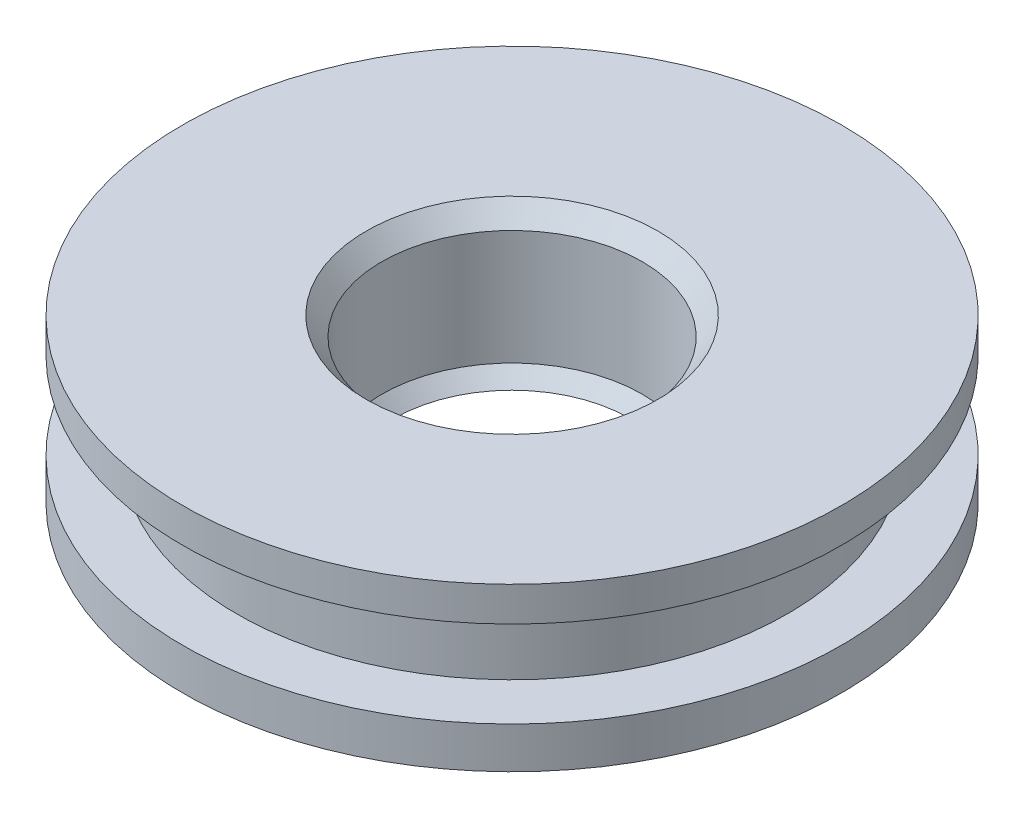
ISO-10303-21;
HEADER;
FILE_DESCRIPTION(('STEP AP214'),'2;1');
FILE_NAME('part.step','',(''),(''),'','','');
FILE_SCHEMA(('AUTOMOTIVE_DESIGN { 1 0 10303 214 1 1 1 1 }'));
ENDSEC;
DATA;
#1=APPLICATION_CONTEXT('core data for automotive mechanical design processes');
#2=APPLICATION_PROTOCOL_DEFINITION('international standard','automotive_design',2000,#1);
#3=PRODUCT_CONTEXT('',#1,'mechanical');
#4=PRODUCT('Part','Part','',(#3));
#5=PRODUCT_RELATED_PRODUCT_CATEGORY('part','',(#4));
#6=PRODUCT_DEFINITION_FORMATION('','',#4);
#7=PRODUCT_DEFINITION_CONTEXT('part definition',#1,'design');
#8=PRODUCT_DEFINITION('design','',#6,#7);
#9=PRODUCT_DEFINITION_SHAPE('','',#8);
#10=(LENGTH_UNIT() NAMED_UNIT(*) SI_UNIT(.MILLI.,.METRE.));
#11=(NAMED_UNIT(*) PLANE_ANGLE_UNIT() SI_UNIT($,.RADIAN.));
#12=(NAMED_UNIT(*) SI_UNIT($,.STERADIAN.) SOLID_ANGLE_UNIT());
#13=UNCERTAINTY_MEASURE_WITH_UNIT(LENGTH_MEASURE(1.E-05),#10,'distance_accuracy_value','');
#14=(GEOMETRIC_REPRESENTATION_CONTEXT(3) GLOBAL_UNCERTAINTY_ASSIGNED_CONTEXT((#13)) GLOBAL_UNIT_ASSIGNED_CONTEXT((#10,
#11,#12)) REPRESENTATION_CONTEXT('',''));
#15=CARTESIAN_POINT('',(0.,0.,0.));
#16=DIRECTION('',(0.,0.,1.));
#17=DIRECTION('',(1.,0.,0.));
#18=AXIS2_PLACEMENT_3D('',#15,#16,#17);
#19=CARTESIAN_POINT('',(0.,0.157794160868164,0.));
#20=DIRECTION('',(0.,-1.,0.));
#21=DIRECTION('',(0.,0.,-1.));
#22=AXIS2_PLACEMENT_3D('',#19,#20,#21);
#23=CONICAL_SURFACE('',#22,0.670779617290333,1.18682389135614);
#24=CARTESIAN_POINT('',(0.,0.0963874246629052,0.));
#25=DIRECTION('',(0.,-1.,0.));
#26=DIRECTION('',(0.,0.,-1.));
#27=AXIS2_PLACEMENT_3D('',#24,#25,#26);
#28=CIRCLE('',#27,0.82276662278317);
#29=CARTESIAN_POINT('',(0.,0.0963874246629052,-0.82276662278317));
#30=VERTEX_POINT('',#29);
#31=EDGE_CURVE('E89',#30,#30,#28,.T.);
#32=ORIENTED_EDGE('',*,*,#31,.T.);
#33=EDGE_LOOP('',(#32));
#34=FACE_BOUND('',#33,.T.);
#35=CARTESIAN_POINT('',(0.,0.157794160868164,0.));
#36=DIRECTION('',(0.,-1.,0.));
#37=DIRECTION('',(0.,0.,-1.));
#38=AXIS2_PLACEMENT_3D('',#35,#36,#37);
#39=CIRCLE('',#38,0.670779617290333);
#40=CARTESIAN_POINT('',(0.,0.157794160868164,-0.670779617290333));
#41=VERTEX_POINT('',#40);
#42=EDGE_CURVE('E10',#41,#41,#39,.T.);
#43=ORIENTED_EDGE('',*,*,#42,.F.);
#44=EDGE_LOOP('',(#43));
#45=FACE_BOUND('',#44,.T.);
#46=ADVANCED_FACE('F36',(#34,#45),#23,.F.);
#47=CARTESIAN_POINT('',(0.51311346160993,0.157794160868164,0.));
#48=DIRECTION('',(0.,-1.,0.));
#49=DIRECTION('',(0.,0.,-1.));
#50=AXIS2_PLACEMENT_3D('',#47,#48,#49);
#51=PLANE('',#50);
#52=ORIENTED_EDGE('',*,*,#42,.T.);
#53=EDGE_LOOP('',(#52));
#54=FACE_BOUND('',#53,.T.);
#55=CARTESIAN_POINT('',(0.,0.157794160868164,0.));
#56=DIRECTION('',(0.,-1.,0.));
#57=DIRECTION('',(0.,0.,-1.));
#58=AXIS2_PLACEMENT_3D('',#55,#56,#57);
#59=CIRCLE('',#58,0.51311346160993);
#60=CARTESIAN_POINT('',(0.,0.157794160868164,-0.51311346160993));
#61=VERTEX_POINT('',#60);
#62=EDGE_CURVE('E43',#61,#61,#59,.T.);
#63=ORIENTED_EDGE('',*,*,#62,.F.);
#64=EDGE_LOOP('',(#63));
#65=FACE_BOUND('',#64,.T.);
#66=ADVANCED_FACE('F109',(#54,#65),#51,.T.);
#67=CARTESIAN_POINT('',(0.,0.222150740537871,0.));
#68=DIRECTION('',(0.,1.,0.));
#69=DIRECTION('',(0.,0.,1.));
#70=AXIS2_PLACEMENT_3D('',#67,#68,#69);
#71=CONICAL_SURFACE('',#70,0.567115043874612,0.698131700797725);
#72=ORIENTED_EDGE('',*,*,#62,.T.);
#73=EDGE_LOOP('',(#72));
#74=FACE_BOUND('',#73,.T.);
#75=CARTESIAN_POINT('',(0.,0.222150740537871,0.));
#76=DIRECTION('',(0.,-1.,0.));
#77=DIRECTION('',(0.,0.,-1.));
#78=AXIS2_PLACEMENT_3D('',#75,#76,#77);
#79=CIRCLE('',#78,0.567115043874612);
#80=CARTESIAN_POINT('',(0.,0.222150740537871,-0.567115043874612));
#81=VERTEX_POINT('',#80);
#82=EDGE_CURVE('E49',#81,#81,#79,.T.);
#83=ORIENTED_EDGE('',*,*,#82,.F.);
#84=EDGE_LOOP('',(#83));
#85=FACE_BOUND('',#84,.T.);
#86=ADVANCED_FACE('F113',(#74,#85),#71,.F.);
#87=CARTESIAN_POINT('',(0.,-1.57322745356945,0.));
#88=DIRECTION('',(0.,-1.,0.));
#89=DIRECTION('',(0.,0.,-1.));
#90=AXIS2_PLACEMENT_3D('',#87,#88,#89);
#91=CYLINDRICAL_SURFACE('',#90,0.567115043874612);
#92=ORIENTED_EDGE('',*,*,#82,.T.);
#93=EDGE_LOOP('',(#92));
#94=FACE_BOUND('',#93,.T.);
#95=CARTESIAN_POINT('',(0.,0.722150740537871,0.));
#96=DIRECTION('',(0.,-1.,0.));
#97=DIRECTION('',(0.,0.,-1.));
#98=AXIS2_PLACEMENT_3D('',#95,#96,#97);
#99=CIRCLE('',#98,0.567115043874612);
#100=CARTESIAN_POINT('',(0.,0.722150740537871,-0.567115043874612));
#101=VERTEX_POINT('',#100);
#102=EDGE_CURVE('E55',#101,#101,#99,.T.);
#103=ORIENTED_EDGE('',*,*,#102,.F.);
#104=EDGE_LOOP('',(#103));
#105=FACE_BOUND('',#104,.T.);
#106=ADVANCED_FACE('F117',(#94,#105),#91,.F.);
#107=CARTESIAN_POINT('',(0.,0.803435537863794,0.));
#108=DIRECTION('',(0.,1.,0.));
#109=DIRECTION('',(0.,0.,1.));
#110=AXIS2_PLACEMENT_3D('',#107,#108,#109);
#111=CONICAL_SURFACE('',#110,0.635321087331112,0.698131700797726);
#112=ORIENTED_EDGE('',*,*,#102,.T.);
#113=EDGE_LOOP('',(#112));
#114=FACE_BOUND('',#113,.T.);
#115=CARTESIAN_POINT('',(0.,0.803435537863794,0.));
#116=DIRECTION('',(0.,-1.,0.));
#117=DIRECTION('',(0.,0.,-1.));
#118=AXIS2_PLACEMENT_3D('',#115,#116,#117);
#119=CIRCLE('',#118,0.635321087331112);
#120=CARTESIAN_POINT('',(0.,0.803435537863794,-0.635321087331112));
#121=VERTEX_POINT('',#120);
#122=EDGE_CURVE('E61',#121,#121,#119,.T.);
#123=ORIENTED_EDGE('',*,*,#122,.F.);
#124=EDGE_LOOP('',(#123));
#125=FACE_BOUND('',#124,.T.);
#126=ADVANCED_FACE('F123',(#114,#125),#111,.F.);
#127=CARTESIAN_POINT('',(0.635321087331112,0.803435537863793,0.));
#128=DIRECTION('',(0.,1.,0.));
#129=DIRECTION('',(0.,0.,1.));
#130=AXIS2_PLACEMENT_3D('',#127,#128,#129);
#131=PLANE('',#130);
#132=ORIENTED_EDGE('',*,*,#122,.T.);
#133=EDGE_LOOP('',(#132));
#134=FACE_BOUND('',#133,.T.);
#135=CARTESIAN_POINT('',(0.,0.803435537863794,0.));
#136=DIRECTION('',(0.,-1.,0.));
#137=DIRECTION('',(0.,0.,-1.));
#138=AXIS2_PLACEMENT_3D('',#135,#136,#137);
#139=CIRCLE('',#138,1.43532108733111);
#140=CARTESIAN_POINT('',(0.,0.803435537863794,-1.43532108733111));
#141=VERTEX_POINT('',#140);
#142=EDGE_CURVE('E65',#141,#141,#139,.T.);
#143=ORIENTED_EDGE('',*,*,#142,.F.);
#144=EDGE_LOOP('',(#143));
#145=FACE_BOUND('',#144,.T.);
#146=ADVANCED_FACE('F127',(#134,#145),#131,.T.);
#147=CARTESIAN_POINT('',(0.,-1.57322745356945,0.));
#148=DIRECTION('',(0.,-1.,0.));
#149=DIRECTION('',(0.,0.,-1.));
#150=AXIS2_PLACEMENT_3D('',#147,#148,#149);
#151=CYLINDRICAL_SURFACE('',#150,1.43532108733111);
#152=ORIENTED_EDGE('',*,*,#142,.T.);
#153=EDGE_LOOP('',(#152));
#154=FACE_BOUND('',#153,.T.);
#155=CARTESIAN_POINT('',(0.,0.653435537863794,0.));
#156=DIRECTION('',(0.,-1.,0.));
#157=DIRECTION('',(0.,0.,-1.));
#158=AXIS2_PLACEMENT_3D('',#155,#156,#157);
#159=CIRCLE('',#158,1.43532108733111);
#160=CARTESIAN_POINT('',(0.,0.653435537863794,-1.43532108733111));
#161=VERTEX_POINT('',#160);
#162=EDGE_CURVE('E69',#161,#161,#159,.T.);
#163=ORIENTED_EDGE('',*,*,#162,.F.);
#164=EDGE_LOOP('',(#163));
#165=FACE_BOUND('',#164,.T.);
#166=ADVANCED_FACE('F131',(#154,#165),#151,.T.);
#167=CARTESIAN_POINT('',(1.19924890039398,0.653435537863793,0.));
#168=DIRECTION('',(0.,-1.,0.));
#169=DIRECTION('',(0.,0.,-1.));
#170=AXIS2_PLACEMENT_3D('',#167,#168,#169);
#171=PLANE('',#170);
#172=ORIENTED_EDGE('',*,*,#162,.T.);
#173=EDGE_LOOP('',(#172));
#174=FACE_BOUND('',#173,.T.);
#175=CARTESIAN_POINT('',(0.,0.653435537863794,0.));
#176=DIRECTION('',(0.,-1.,0.));
#177=DIRECTION('',(0.,0.,-1.));
#178=AXIS2_PLACEMENT_3D('',#175,#176,#177);
#179=CIRCLE('',#178,1.19924890039398);
#180=CARTESIAN_POINT('',(0.,0.653435537863794,-1.19924890039398));
#181=VERTEX_POINT('',#180);
#182=EDGE_CURVE('E73',#181,#181,#179,.T.);
#183=ORIENTED_EDGE('',*,*,#182,.F.);
#184=EDGE_LOOP('',(#183));
#185=FACE_BOUND('',#184,.T.);
#186=ADVANCED_FACE('F135',(#174,#185),#171,.T.);
#187=CARTESIAN_POINT('',(0.,-1.57322745356945,0.));
#188=DIRECTION('',(0.,-1.,0.));
#189=DIRECTION('',(0.,0.,-1.));
#190=AXIS2_PLACEMENT_3D('',#187,#188,#189);
#191=CYLINDRICAL_SURFACE('',#190,1.19924890039398);
#192=ORIENTED_EDGE('',*,*,#182,.T.);
#193=EDGE_LOOP('',(#192));
#194=FACE_BOUND('',#193,.T.);
#195=CARTESIAN_POINT('',(0.,0.276387424662905,0.));
#196=DIRECTION('',(0.,-1.,0.));
#197=DIRECTION('',(0.,0.,-1.));
#198=AXIS2_PLACEMENT_3D('',#195,#196,#197);
#199=CIRCLE('',#198,1.19924890039398);
#200=CARTESIAN_POINT('',(0.,0.276387424662905,-1.19924890039398));
#201=VERTEX_POINT('',#200);
#202=EDGE_CURVE('E77',#201,#201,#199,.T.);
#203=ORIENTED_EDGE('',*,*,#202,.F.);
#204=EDGE_LOOP('',(#203));
#205=FACE_BOUND('',#204,.T.);
#206=ADVANCED_FACE('F139',(#194,#205),#191,.T.);
#207=CARTESIAN_POINT('',(1.43532108733111,0.276387424662905,0.));
#208=DIRECTION('',(0.,1.,0.));
#209=DIRECTION('',(0.,0.,1.));
#210=AXIS2_PLACEMENT_3D('',#207,#208,#209);
#211=PLANE('',#210);
#212=ORIENTED_EDGE('',*,*,#202,.T.);
#213=EDGE_LOOP('',(#212));
#214=FACE_BOUND('',#213,.T.);
#215=CARTESIAN_POINT('',(0.,0.276387424662905,0.));
#216=DIRECTION('',(0.,-1.,0.));
#217=DIRECTION('',(0.,0.,-1.));
#218=AXIS2_PLACEMENT_3D('',#215,#216,#217);
#219=CIRCLE('',#218,1.43532108733111);
#220=CARTESIAN_POINT('',(0.,0.276387424662905,-1.43532108733111));
#221=VERTEX_POINT('',#220);
#222=EDGE_CURVE('E81',#221,#221,#219,.T.);
#223=ORIENTED_EDGE('',*,*,#222,.F.);
#224=EDGE_LOOP('',(#223));
#225=FACE_BOUND('',#224,.T.);
#226=ADVANCED_FACE('F105',(#214,#225),#211,.T.);
#227=CARTESIAN_POINT('',(0.,-1.57322745356945,0.));
#228=DIRECTION('',(0.,-1.,0.));
#229=DIRECTION('',(0.,0.,-1.));
#230=AXIS2_PLACEMENT_3D('',#227,#228,#229);
#231=CYLINDRICAL_SURFACE('',#230,1.43532108733111);
#232=ORIENTED_EDGE('',*,*,#222,.T.);
#233=EDGE_LOOP('',(#232));
#234=FACE_BOUND('',#233,.T.);
#235=CARTESIAN_POINT('',(0.,0.0963874246629052,0.));
#236=DIRECTION('',(0.,-1.,0.));
#237=DIRECTION('',(0.,0.,-1.));
#238=AXIS2_PLACEMENT_3D('',#235,#236,#237);
#239=CIRCLE('',#238,1.43532108733111);
#240=CARTESIAN_POINT('',(0.,0.0963874246629052,-1.43532108733111));
#241=VERTEX_POINT('',#240);
#242=EDGE_CURVE('E85',#241,#241,#239,.T.);
#243=ORIENTED_EDGE('',*,*,#242,.F.);
#244=EDGE_LOOP('',(#243));
#245=FACE_BOUND('',#244,.T.);
#246=ADVANCED_FACE('F99',(#234,#245),#231,.T.);
#247=CARTESIAN_POINT('',(0.82276662278317,0.0963874246629052,0.));
#248=DIRECTION('',(0.,-1.,0.));
#249=DIRECTION('',(0.,0.,-1.));
#250=AXIS2_PLACEMENT_3D('',#247,#248,#249);
#251=PLANE('',#250);
#252=ORIENTED_EDGE('',*,*,#242,.T.);
#253=EDGE_LOOP('',(#252));
#254=FACE_BOUND('',#253,.T.);
#255=ORIENTED_EDGE('',*,*,#31,.F.);
#256=EDGE_LOOP('',(#255));
#257=FACE_BOUND('',#256,.T.);
#258=ADVANCED_FACE('F97',(#254,#257),#251,.T.);
#259=CLOSED_SHELL('',(#46,#66,#86,#106,#126,#146,#166,#186,#206,#226,#246,#258));
#260=MANIFOLD_SOLID_BREP('B2',#259);
#261=ADVANCED_BREP_SHAPE_REPRESENTATION('',(#18,#260),#14);
#262=SHAPE_DEFINITION_REPRESENTATION(#9,#261);
ENDSEC;
END-ISO-10303-21;
